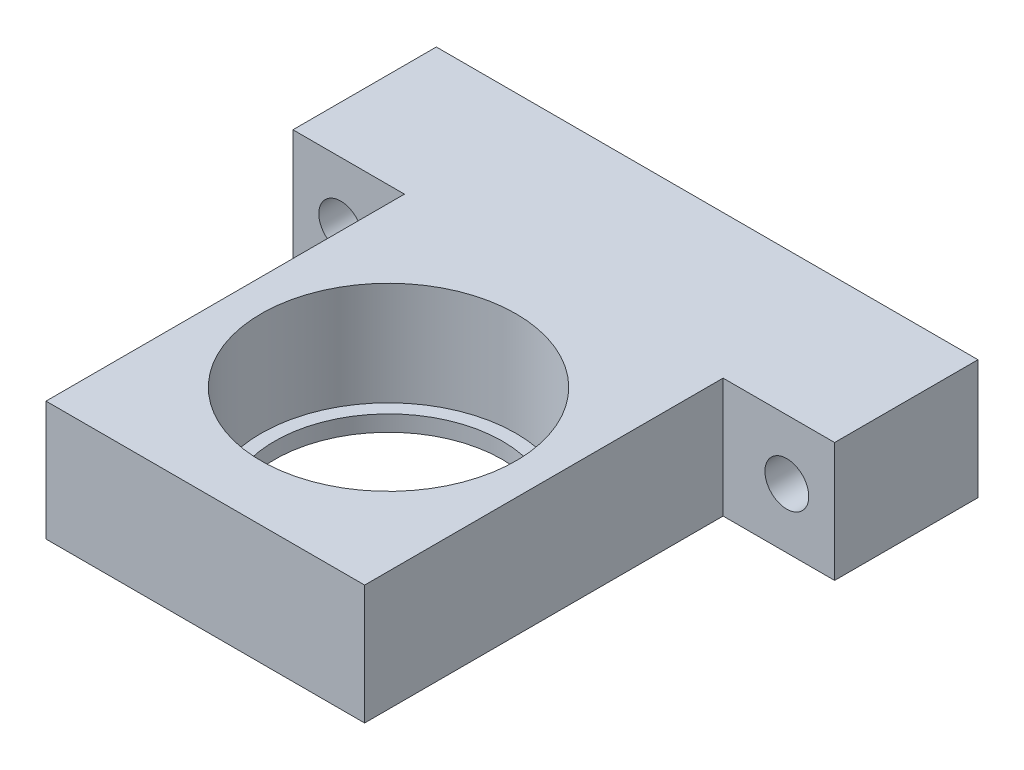
ISO-10303-21;
HEADER;
FILE_DESCRIPTION(('STEP AP214'),'2;1');
FILE_NAME('part.step','',(''),(''),'','','');
FILE_SCHEMA(('AUTOMOTIVE_DESIGN { 1 0 10303 214 1 1 1 1 }'));
ENDSEC;
DATA;
#1=APPLICATION_CONTEXT('core data for automotive mechanical design processes');
#2=APPLICATION_PROTOCOL_DEFINITION('international standard','automotive_design',2000,#1);
#3=PRODUCT_CONTEXT('',#1,'mechanical');
#4=PRODUCT('Part','Part','',(#3));
#5=PRODUCT_RELATED_PRODUCT_CATEGORY('part','',(#4));
#6=PRODUCT_DEFINITION_FORMATION('','',#4);
#7=PRODUCT_DEFINITION_CONTEXT('part definition',#1,'design');
#8=PRODUCT_DEFINITION('design','',#6,#7);
#9=PRODUCT_DEFINITION_SHAPE('','',#8);
#10=(LENGTH_UNIT() NAMED_UNIT(*) SI_UNIT(.MILLI.,.METRE.));
#11=(NAMED_UNIT(*) PLANE_ANGLE_UNIT() SI_UNIT($,.RADIAN.));
#12=(NAMED_UNIT(*) SI_UNIT($,.STERADIAN.) SOLID_ANGLE_UNIT());
#13=UNCERTAINTY_MEASURE_WITH_UNIT(LENGTH_MEASURE(1.E-05),#10,'distance_accuracy_value','');
#14=(GEOMETRIC_REPRESENTATION_CONTEXT(3) GLOBAL_UNCERTAINTY_ASSIGNED_CONTEXT((#13)) GLOBAL_UNIT_ASSIGNED_CONTEXT((#10,
#11,#12)) REPRESENTATION_CONTEXT('',''));
#15=CARTESIAN_POINT('',(0.,0.,0.));
#16=DIRECTION('',(0.,0.,1.));
#17=DIRECTION('',(1.,0.,0.));
#18=AXIS2_PLACEMENT_3D('',#15,#16,#17);
#19=CARTESIAN_POINT('',(0.,35.5,40.));
#20=DIRECTION('',(0.,-1.,0.));
#21=DIRECTION('',(1.,0.,0.));
#22=AXIS2_PLACEMENT_3D('',#19,#20,#21);
#23=CYLINDRICAL_SURFACE('',#22,16.);
#24=CARTESIAN_POINT('',(0.,7.5,40.));
#25=DIRECTION('',(0.,-1.,0.));
#26=DIRECTION('',(0.,0.,-1.));
#27=AXIS2_PLACEMENT_3D('',#24,#25,#26);
#28=CIRCLE('',#27,16.);
#29=CARTESIAN_POINT('',(0.,7.5,24.));
#30=VERTEX_POINT('',#29);
#31=EDGE_CURVE('E202',#30,#30,#28,.T.);
#32=ORIENTED_EDGE('',*,*,#31,.F.);
#33=EDGE_LOOP('',(#32));
#34=FACE_BOUND('',#33,.T.);
#35=CARTESIAN_POINT('',(0.,-5.5,40.));
#36=DIRECTION('',(0.,-1.,0.));
#37=DIRECTION('',(0.,0.,-1.));
#38=AXIS2_PLACEMENT_3D('',#35,#36,#37);
#39=CIRCLE('',#38,16.);
#40=CARTESIAN_POINT('',(0.,-5.5,24.));
#41=VERTEX_POINT('',#40);
#42=EDGE_CURVE('E11',#41,#41,#39,.F.);
#43=ORIENTED_EDGE('',*,*,#42,.F.);
#44=EDGE_LOOP('',(#43));
#45=FACE_BOUND('',#44,.T.);
#46=ADVANCED_FACE('F39',(#34,#45),#23,.F.);
#47=CARTESIAN_POINT('',(0.,0.,18.));
#48=DIRECTION('',(0.,0.,1.));
#49=DIRECTION('',(1.,0.,0.));
#50=AXIS2_PLACEMENT_3D('',#47,#48,#49);
#51=PLANE('',#50);
#52=CARTESIAN_POINT('',(28.,0.,18.));
#53=DIRECTION('',(0.,0.,1.));
#54=DIRECTION('',(1.,0.,0.));
#55=AXIS2_PLACEMENT_3D('',#52,#53,#54);
#56=CIRCLE('',#55,2.75);
#57=CARTESIAN_POINT('',(30.75,0.,18.));
#58=VERTEX_POINT('',#57);
#59=EDGE_CURVE('E182',#58,#58,#56,.T.);
#60=ORIENTED_EDGE('',*,*,#59,.F.);
#61=EDGE_LOOP('',(#60));
#62=FACE_BOUND('',#61,.T.);
#63=DIRECTION('',(0.,1.,0.));
#64=VECTOR('',#63,1.);
#65=CARTESIAN_POINT('',(20.,7.5,18.));
#66=LINE('',#65,#64);
#67=CARTESIAN_POINT('',(20.,-7.5,18.));
#68=VERTEX_POINT('',#67);
#69=CARTESIAN_POINT('',(20.,7.5,18.));
#70=VERTEX_POINT('',#69);
#71=EDGE_CURVE('E57',#68,#70,#66,.T.);
#72=ORIENTED_EDGE('',*,*,#71,.F.);
#73=DIRECTION('',(1.,0.,0.));
#74=VECTOR('',#73,1.);
#75=CARTESIAN_POINT('',(-34.,-7.5,18.));
#76=LINE('',#75,#74);
#77=CARTESIAN_POINT('',(34.,-7.5,18.));
#78=VERTEX_POINT('',#77);
#79=EDGE_CURVE('E154',#68,#78,#76,.T.);
#80=ORIENTED_EDGE('',*,*,#79,.T.);
#81=DIRECTION('',(0.,1.,0.));
#82=VECTOR('',#81,1.);
#83=CARTESIAN_POINT('',(34.,7.5,18.));
#84=LINE('',#83,#82);
#85=CARTESIAN_POINT('',(34.,7.5,18.));
#86=VERTEX_POINT('',#85);
#87=EDGE_CURVE('E142',#78,#86,#84,.T.);
#88=ORIENTED_EDGE('',*,*,#87,.T.);
#89=DIRECTION('',(-1.,0.,0.));
#90=VECTOR('',#89,1.);
#91=CARTESIAN_POINT('',(-34.,7.5,18.));
#92=LINE('',#91,#90);
#93=EDGE_CURVE('E148',#86,#70,#92,.T.);
#94=ORIENTED_EDGE('',*,*,#93,.T.);
#95=EDGE_LOOP('',(#72,#80,#88,#94));
#96=FACE_BOUND('',#95,.T.);
#97=ADVANCED_FACE('F239',(#62,#96),#51,.T.);
#98=CARTESIAN_POINT('',(34.,7.5,18.));
#99=DIRECTION('',(-1.,0.,0.));
#100=DIRECTION('',(0.,0.,1.));
#101=AXIS2_PLACEMENT_3D('',#98,#99,#100);
#102=PLANE('',#101);
#103=DIRECTION('',(0.,1.,0.));
#104=VECTOR('',#103,1.);
#105=CARTESIAN_POINT('',(34.,7.5,0.));
#106=LINE('',#105,#104);
#107=CARTESIAN_POINT('',(34.,-7.5,0.));
#108=VERTEX_POINT('',#107);
#109=CARTESIAN_POINT('',(34.,7.5,0.));
#110=VERTEX_POINT('',#109);
#111=EDGE_CURVE('E131',#108,#110,#106,.T.);
#112=ORIENTED_EDGE('',*,*,#111,.T.);
#113=DIRECTION('',(0.,0.,-1.));
#114=VECTOR('',#113,1.);
#115=CARTESIAN_POINT('',(34.,7.5,18.));
#116=LINE('',#115,#114);
#117=EDGE_CURVE('E49',#86,#110,#116,.T.);
#118=ORIENTED_EDGE('',*,*,#117,.F.);
#119=ORIENTED_EDGE('',*,*,#87,.F.);
#120=DIRECTION('',(0.,0.,-1.));
#121=VECTOR('',#120,1.);
#122=CARTESIAN_POINT('',(34.,-7.5,18.));
#123=LINE('',#122,#121);
#124=EDGE_CURVE('E157',#78,#108,#123,.T.);
#125=ORIENTED_EDGE('',*,*,#124,.T.);
#126=EDGE_LOOP('',(#112,#118,#119,#125));
#127=FACE_BOUND('',#126,.T.);
#128=ADVANCED_FACE('F41',(#127),#102,.F.);
#129=CARTESIAN_POINT('',(-34.,7.5,18.));
#130=DIRECTION('',(0.,-1.,0.));
#131=DIRECTION('',(0.,0.,-1.));
#132=AXIS2_PLACEMENT_3D('',#129,#130,#131);
#133=PLANE('',#132);
#134=ORIENTED_EDGE('',*,*,#31,.T.);
#135=EDGE_LOOP('',(#134));
#136=FACE_BOUND('',#135,.T.);
#137=DIRECTION('',(-1.,0.,0.));
#138=VECTOR('',#137,1.);
#139=CARTESIAN_POINT('',(-34.,7.5,0.));
#140=LINE('',#139,#138);
#141=CARTESIAN_POINT('',(-34.,7.5,0.));
#142=VERTEX_POINT('',#141);
#143=EDGE_CURVE('E136',#110,#142,#140,.T.);
#144=ORIENTED_EDGE('',*,*,#143,.T.);
#145=DIRECTION('',(0.,0.,-1.));
#146=VECTOR('',#145,1.);
#147=CARTESIAN_POINT('',(-34.,7.5,18.));
#148=LINE('',#147,#146);
#149=CARTESIAN_POINT('',(-34.,7.5,18.));
#150=VERTEX_POINT('',#149);
#151=EDGE_CURVE('E173',#150,#142,#148,.T.);
#152=ORIENTED_EDGE('',*,*,#151,.F.);
#153=CARTESIAN_POINT('',(-20.,7.5,18.));
#154=VERTEX_POINT('',#153);
#155=EDGE_CURVE('E146',#154,#150,#92,.T.);
#156=ORIENTED_EDGE('',*,*,#155,.F.);
#157=DIRECTION('',(0.,0.,-1.));
#158=VECTOR('',#157,1.);
#159=CARTESIAN_POINT('',(-20.,7.5,63.));
#160=LINE('',#159,#158);
#161=CARTESIAN_POINT('',(-20.,7.5,63.));
#162=VERTEX_POINT('',#161);
#163=EDGE_CURVE('E113',#162,#154,#160,.T.);
#164=ORIENTED_EDGE('',*,*,#163,.F.);
#165=DIRECTION('',(-1.,0.,0.));
#166=VECTOR('',#165,1.);
#167=CARTESIAN_POINT('',(-20.,7.5,63.));
#168=LINE('',#167,#166);
#169=CARTESIAN_POINT('',(20.,7.5,63.));
#170=VERTEX_POINT('',#169);
#171=EDGE_CURVE('E107',#170,#162,#168,.T.);
#172=ORIENTED_EDGE('',*,*,#171,.F.);
#173=DIRECTION('',(0.,0.,-1.));
#174=VECTOR('',#173,1.);
#175=CARTESIAN_POINT('',(20.,7.5,63.));
#176=LINE('',#175,#174);
#177=EDGE_CURVE('E111',#170,#70,#176,.T.);
#178=ORIENTED_EDGE('',*,*,#177,.T.);
#179=ORIENTED_EDGE('',*,*,#93,.F.);
#180=ORIENTED_EDGE('',*,*,#117,.T.);
#181=EDGE_LOOP('',(#144,#152,#156,#164,#172,#178,#179,#180));
#182=FACE_BOUND('',#181,.T.);
#183=ADVANCED_FACE('F109',(#136,#182),#133,.F.);
#184=CARTESIAN_POINT('',(-34.,7.5,18.));
#185=DIRECTION('',(1.,0.,0.));
#186=DIRECTION('',(0.,0.,-1.));
#187=AXIS2_PLACEMENT_3D('',#184,#185,#186);
#188=PLANE('',#187);
#189=DIRECTION('',(0.,-1.,0.));
#190=VECTOR('',#189,1.);
#191=CARTESIAN_POINT('',(-34.,7.5,0.));
#192=LINE('',#191,#190);
#193=CARTESIAN_POINT('',(-34.,-7.5,0.));
#194=VERTEX_POINT('',#193);
#195=EDGE_CURVE('E161',#142,#194,#192,.T.);
#196=ORIENTED_EDGE('',*,*,#195,.T.);
#197=DIRECTION('',(0.,0.,-1.));
#198=VECTOR('',#197,1.);
#199=CARTESIAN_POINT('',(-34.,-7.5,18.));
#200=LINE('',#199,#198);
#201=CARTESIAN_POINT('',(-34.,-7.5,18.));
#202=VERTEX_POINT('',#201);
#203=EDGE_CURVE('E169',#202,#194,#200,.T.);
#204=ORIENTED_EDGE('',*,*,#203,.F.);
#205=DIRECTION('',(0.,-1.,0.));
#206=VECTOR('',#205,1.);
#207=CARTESIAN_POINT('',(-34.,7.5,18.));
#208=LINE('',#207,#206);
#209=EDGE_CURVE('E151',#150,#202,#208,.T.);
#210=ORIENTED_EDGE('',*,*,#209,.F.);
#211=ORIENTED_EDGE('',*,*,#151,.T.);
#212=EDGE_LOOP('',(#196,#204,#210,#211));
#213=FACE_BOUND('',#212,.T.);
#214=ADVANCED_FACE('F282',(#213),#188,.F.);
#215=CARTESIAN_POINT('',(-34.,-7.5,18.));
#216=DIRECTION('',(0.,1.,0.));
#217=DIRECTION('',(0.,0.,1.));
#218=AXIS2_PLACEMENT_3D('',#215,#216,#217);
#219=PLANE('',#218);
#220=DIRECTION('',(1.,0.,0.));
#221=VECTOR('',#220,1.);
#222=CARTESIAN_POINT('',(-34.,-7.5,0.));
#223=LINE('',#222,#221);
#224=EDGE_CURVE('E147',#194,#108,#223,.T.);
#225=ORIENTED_EDGE('',*,*,#224,.T.);
#226=ORIENTED_EDGE('',*,*,#124,.F.);
#227=ORIENTED_EDGE('',*,*,#79,.F.);
#228=DIRECTION('',(0.,0.,-1.));
#229=VECTOR('',#228,1.);
#230=CARTESIAN_POINT('',(20.,-7.5,63.));
#231=LINE('',#230,#229);
#232=CARTESIAN_POINT('',(20.,-7.5,63.));
#233=VERTEX_POINT('',#232);
#234=EDGE_CURVE('E213',#233,#68,#231,.T.);
#235=ORIENTED_EDGE('',*,*,#234,.F.);
#236=DIRECTION('',(1.,0.,0.));
#237=VECTOR('',#236,1.);
#238=CARTESIAN_POINT('',(-20.,-7.5,63.));
#239=LINE('',#238,#237);
#240=CARTESIAN_POINT('',(-20.,-7.5,63.));
#241=VERTEX_POINT('',#240);
#242=EDGE_CURVE('E123',#241,#233,#239,.T.);
#243=ORIENTED_EDGE('',*,*,#242,.F.);
#244=DIRECTION('',(0.,0.,-1.));
#245=VECTOR('',#244,1.);
#246=CARTESIAN_POINT('',(-20.,-7.5,63.));
#247=LINE('',#246,#245);
#248=CARTESIAN_POINT('',(-20.,-7.5,18.));
#249=VERTEX_POINT('',#248);
#250=EDGE_CURVE('E138',#241,#249,#247,.T.);
#251=ORIENTED_EDGE('',*,*,#250,.T.);
#252=EDGE_CURVE('E155',#202,#249,#76,.T.);
#253=ORIENTED_EDGE('',*,*,#252,.F.);
#254=ORIENTED_EDGE('',*,*,#203,.T.);
#255=EDGE_LOOP('',(#225,#226,#227,#235,#243,#251,#253,#254));
#256=FACE_BOUND('',#255,.T.);
#257=CARTESIAN_POINT('',(0.,-7.5,40.));
#258=DIRECTION('',(0.,-1.,0.));
#259=DIRECTION('',(0.,0.,-1.));
#260=AXIS2_PLACEMENT_3D('',#257,#258,#259);
#261=CIRCLE('',#260,14.3);
#262=CARTESIAN_POINT('',(0.,-7.5,25.7));
#263=VERTEX_POINT('',#262);
#264=EDGE_CURVE('E188',#263,#263,#261,.T.);
#265=ORIENTED_EDGE('',*,*,#264,.F.);
#266=EDGE_LOOP('',(#265));
#267=FACE_BOUND('',#266,.T.);
#268=ADVANCED_FACE('F224',(#256,#267),#219,.F.);
#269=CARTESIAN_POINT('',(-28.,0.,18.));
#270=DIRECTION('',(0.,0.,1.));
#271=DIRECTION('',(1.,0.,0.));
#272=AXIS2_PLACEMENT_3D('',#269,#270,#271);
#273=CIRCLE('',#272,2.75);
#274=CARTESIAN_POINT('',(-25.25,0.,18.));
#275=VERTEX_POINT('',#274);
#276=EDGE_CURVE('E190',#275,#275,#273,.T.);
#277=ORIENTED_EDGE('',*,*,#276,.F.);
#278=EDGE_LOOP('',(#277));
#279=FACE_BOUND('',#278,.T.);
#280=DIRECTION('',(0.,-1.,0.));
#281=VECTOR('',#280,1.);
#282=CARTESIAN_POINT('',(-20.,7.5,18.));
#283=LINE('',#282,#281);
#284=EDGE_CURVE('E65',#154,#249,#283,.T.);
#285=ORIENTED_EDGE('',*,*,#284,.F.);
#286=ORIENTED_EDGE('',*,*,#155,.T.);
#287=ORIENTED_EDGE('',*,*,#209,.T.);
#288=ORIENTED_EDGE('',*,*,#252,.T.);
#289=EDGE_LOOP('',(#285,#286,#287,#288));
#290=FACE_BOUND('',#289,.T.);
#291=ADVANCED_FACE('F247',(#279,#290),#51,.T.);
#292=CARTESIAN_POINT('',(0.,0.,0.));
#293=DIRECTION('',(0.,0.,1.));
#294=DIRECTION('',(1.,0.,0.));
#295=AXIS2_PLACEMENT_3D('',#292,#293,#294);
#296=PLANE('',#295);
#297=CARTESIAN_POINT('',(28.,0.,0.));
#298=DIRECTION('',(0.,0.,1.));
#299=DIRECTION('',(1.,0.,0.));
#300=AXIS2_PLACEMENT_3D('',#297,#298,#299);
#301=CIRCLE('',#300,2.75);
#302=CARTESIAN_POINT('',(30.75,0.,0.));
#303=VERTEX_POINT('',#302);
#304=EDGE_CURVE('E43',#303,#303,#301,.T.);
#305=ORIENTED_EDGE('',*,*,#304,.T.);
#306=EDGE_LOOP('',(#305));
#307=FACE_BOUND('',#306,.T.);
#308=CARTESIAN_POINT('',(-28.,0.,0.));
#309=DIRECTION('',(0.,0.,1.));
#310=DIRECTION('',(1.,0.,0.));
#311=AXIS2_PLACEMENT_3D('',#308,#309,#310);
#312=CIRCLE('',#311,2.75);
#313=CARTESIAN_POINT('',(-25.25,0.,0.));
#314=VERTEX_POINT('',#313);
#315=EDGE_CURVE('E179',#314,#314,#312,.T.);
#316=ORIENTED_EDGE('',*,*,#315,.T.);
#317=EDGE_LOOP('',(#316));
#318=FACE_BOUND('',#317,.T.);
#319=ORIENTED_EDGE('',*,*,#111,.F.);
#320=ORIENTED_EDGE('',*,*,#224,.F.);
#321=ORIENTED_EDGE('',*,*,#195,.F.);
#322=ORIENTED_EDGE('',*,*,#143,.F.);
#323=EDGE_LOOP('',(#319,#320,#321,#322));
#324=FACE_BOUND('',#323,.T.);
#325=ADVANCED_FACE('F236',(#307,#318,#324),#296,.F.);
#326=CARTESIAN_POINT('',(20.,7.5,63.));
#327=DIRECTION('',(-1.,0.,0.));
#328=DIRECTION('',(0.,0.,1.));
#329=AXIS2_PLACEMENT_3D('',#326,#327,#328);
#330=PLANE('',#329);
#331=ORIENTED_EDGE('',*,*,#71,.T.);
#332=ORIENTED_EDGE('',*,*,#177,.F.);
#333=DIRECTION('',(0.,1.,0.));
#334=VECTOR('',#333,1.);
#335=CARTESIAN_POINT('',(20.,7.5,63.));
#336=LINE('',#335,#334);
#337=EDGE_CURVE('E118',#233,#170,#336,.T.);
#338=ORIENTED_EDGE('',*,*,#337,.F.);
#339=ORIENTED_EDGE('',*,*,#234,.T.);
#340=EDGE_LOOP('',(#331,#332,#338,#339));
#341=FACE_BOUND('',#340,.T.);
#342=ADVANCED_FACE('F129',(#341),#330,.F.);
#343=CARTESIAN_POINT('',(-20.,7.5,63.));
#344=DIRECTION('',(1.,0.,0.));
#345=DIRECTION('',(0.,0.,-1.));
#346=AXIS2_PLACEMENT_3D('',#343,#344,#345);
#347=PLANE('',#346);
#348=ORIENTED_EDGE('',*,*,#284,.T.);
#349=ORIENTED_EDGE('',*,*,#250,.F.);
#350=DIRECTION('',(0.,-1.,0.));
#351=VECTOR('',#350,1.);
#352=CARTESIAN_POINT('',(-20.,7.5,63.));
#353=LINE('',#352,#351);
#354=EDGE_CURVE('E117',#162,#241,#353,.T.);
#355=ORIENTED_EDGE('',*,*,#354,.F.);
#356=ORIENTED_EDGE('',*,*,#163,.T.);
#357=EDGE_LOOP('',(#348,#349,#355,#356));
#358=FACE_BOUND('',#357,.T.);
#359=ADVANCED_FACE('F227',(#358),#347,.F.);
#360=CARTESIAN_POINT('',(0.,0.,63.));
#361=DIRECTION('',(0.,0.,1.));
#362=DIRECTION('',(1.,0.,0.));
#363=AXIS2_PLACEMENT_3D('',#360,#361,#362);
#364=PLANE('',#363);
#365=ORIENTED_EDGE('',*,*,#337,.T.);
#366=ORIENTED_EDGE('',*,*,#171,.T.);
#367=ORIENTED_EDGE('',*,*,#354,.T.);
#368=ORIENTED_EDGE('',*,*,#242,.T.);
#369=EDGE_LOOP('',(#365,#366,#367,#368));
#370=FACE_BOUND('',#369,.T.);
#371=ADVANCED_FACE('F121',(#370),#364,.T.);
#372=CARTESIAN_POINT('',(0.,-5.5,40.));
#373=DIRECTION('',(0.,-1.,0.));
#374=DIRECTION('',(0.,0.,-1.));
#375=AXIS2_PLACEMENT_3D('',#372,#373,#374);
#376=PLANE('',#375);
#377=CARTESIAN_POINT('',(0.,-5.5,40.));
#378=DIRECTION('',(0.,-1.,0.));
#379=DIRECTION('',(0.,0.,-1.));
#380=AXIS2_PLACEMENT_3D('',#377,#378,#379);
#381=CIRCLE('',#380,14.3);
#382=CARTESIAN_POINT('',(0.,-5.5,25.7));
#383=VERTEX_POINT('',#382);
#384=EDGE_CURVE('E198',#383,#383,#381,.T.);
#385=ORIENTED_EDGE('',*,*,#384,.T.);
#386=EDGE_LOOP('',(#385));
#387=FACE_BOUND('',#386,.T.);
#388=ORIENTED_EDGE('',*,*,#42,.T.);
#389=EDGE_LOOP('',(#388));
#390=FACE_BOUND('',#389,.T.);
#391=ADVANCED_FACE('F234',(#387,#390),#376,.F.);
#392=CARTESIAN_POINT('',(0.,-5.5,40.));
#393=DIRECTION('',(0.,-1.,0.));
#394=DIRECTION('',(0.,0.,-1.));
#395=AXIS2_PLACEMENT_3D('',#392,#393,#394);
#396=CYLINDRICAL_SURFACE('',#395,14.3);
#397=ORIENTED_EDGE('',*,*,#384,.F.);
#398=EDGE_LOOP('',(#397));
#399=FACE_BOUND('',#398,.T.);
#400=ORIENTED_EDGE('',*,*,#264,.T.);
#401=EDGE_LOOP('',(#400));
#402=FACE_BOUND('',#401,.T.);
#403=ADVANCED_FACE('F253',(#399,#402),#396,.F.);
#404=CARTESIAN_POINT('',(-28.,0.,-3.));
#405=DIRECTION('',(0.,0.,1.));
#406=DIRECTION('',(1.,0.,0.));
#407=AXIS2_PLACEMENT_3D('',#404,#405,#406);
#408=CYLINDRICAL_SURFACE('',#407,2.75);
#409=CARTESIAN_POINT('',(-25.25,0.,18.));
#410=CARTESIAN_POINT('',(-25.25,0.,17.8125));
#411=CARTESIAN_POINT('',(-25.25,0.,17.625));
#412=CARTESIAN_POINT('',(-25.25,0.,17.25));
#413=CARTESIAN_POINT('',(-25.25,0.,17.0625));
#414=CARTESIAN_POINT('',(-25.25,0.,16.6875));
#415=CARTESIAN_POINT('',(-25.25,0.,16.5));
#416=CARTESIAN_POINT('',(-25.25,0.,16.125));
#417=CARTESIAN_POINT('',(-25.25,0.,15.9375));
#418=CARTESIAN_POINT('',(-25.25,0.,15.5625));
#419=CARTESIAN_POINT('',(-25.25,0.,15.375));
#420=CARTESIAN_POINT('',(-25.25,0.,15.));
#421=CARTESIAN_POINT('',(-25.25,0.,14.8125));
#422=CARTESIAN_POINT('',(-25.25,0.,14.4375));
#423=CARTESIAN_POINT('',(-25.25,0.,14.25));
#424=CARTESIAN_POINT('',(-25.25,0.,13.875));
#425=CARTESIAN_POINT('',(-25.25,0.,13.6875));
#426=CARTESIAN_POINT('',(-25.25,0.,13.3125));
#427=CARTESIAN_POINT('',(-25.25,0.,13.125));
#428=CARTESIAN_POINT('',(-25.25,0.,12.75));
#429=CARTESIAN_POINT('',(-25.25,0.,12.5625));
#430=CARTESIAN_POINT('',(-25.25,0.,12.1875));
#431=CARTESIAN_POINT('',(-25.25,0.,12.));
#432=CARTESIAN_POINT('',(-25.25,0.,11.625));
#433=CARTESIAN_POINT('',(-25.25,0.,11.4375));
#434=CARTESIAN_POINT('',(-25.25,0.,11.0625));
#435=CARTESIAN_POINT('',(-25.25,0.,10.875));
#436=CARTESIAN_POINT('',(-25.25,0.,10.5));
#437=CARTESIAN_POINT('',(-25.25,0.,10.3125));
#438=CARTESIAN_POINT('',(-25.25,0.,9.9375));
#439=CARTESIAN_POINT('',(-25.25,0.,9.75));
#440=CARTESIAN_POINT('',(-25.25,0.,9.375));
#441=CARTESIAN_POINT('',(-25.25,0.,9.1875));
#442=CARTESIAN_POINT('',(-25.25,0.,8.8125));
#443=CARTESIAN_POINT('',(-25.25,0.,8.625));
#444=CARTESIAN_POINT('',(-25.25,0.,8.25));
#445=CARTESIAN_POINT('',(-25.25,0.,8.0625));
#446=CARTESIAN_POINT('',(-25.25,0.,7.6875));
#447=CARTESIAN_POINT('',(-25.25,0.,7.5));
#448=CARTESIAN_POINT('',(-25.25,0.,7.125));
#449=CARTESIAN_POINT('',(-25.25,0.,6.9375));
#450=CARTESIAN_POINT('',(-25.25,0.,6.5625));
#451=CARTESIAN_POINT('',(-25.25,0.,6.375));
#452=CARTESIAN_POINT('',(-25.25,0.,6.));
#453=CARTESIAN_POINT('',(-25.25,0.,5.8125));
#454=CARTESIAN_POINT('',(-25.25,0.,5.4375));
#455=CARTESIAN_POINT('',(-25.25,0.,5.25));
#456=CARTESIAN_POINT('',(-25.25,0.,4.875));
#457=CARTESIAN_POINT('',(-25.25,0.,4.6875));
#458=CARTESIAN_POINT('',(-25.25,0.,4.3125));
#459=CARTESIAN_POINT('',(-25.25,0.,4.125));
#460=CARTESIAN_POINT('',(-25.25,0.,3.75));
#461=CARTESIAN_POINT('',(-25.25,0.,3.5625));
#462=CARTESIAN_POINT('',(-25.25,0.,3.1875));
#463=CARTESIAN_POINT('',(-25.25,0.,3.));
#464=CARTESIAN_POINT('',(-25.25,0.,2.625));
#465=CARTESIAN_POINT('',(-25.25,0.,2.4375));
#466=CARTESIAN_POINT('',(-25.25,0.,2.0625));
#467=CARTESIAN_POINT('',(-25.25,0.,1.875));
#468=CARTESIAN_POINT('',(-25.25,0.,1.5));
#469=CARTESIAN_POINT('',(-25.25,0.,1.3125));
#470=CARTESIAN_POINT('',(-25.25,0.,0.9375));
#471=CARTESIAN_POINT('',(-25.25,0.,0.75));
#472=CARTESIAN_POINT('',(-25.25,0.,0.375));
#473=CARTESIAN_POINT('',(-25.25,0.,0.1875));
#474=CARTESIAN_POINT('',(-25.25,0.,0.));
#475=B_SPLINE_CURVE_WITH_KNOTS('',3,(#409,#410,#411,#412,#413,#414,#415,#416,#417,#418,#419,
#420,#421,#422,#423,#424,#425,#426,#427,#428,#429,#430,#431,#432,#433,#434,#435,#436,#437,#438,
#439,#440,#441,#442,#443,#444,#445,#446,#447,#448,#449,#450,#451,#452,#453,#454,#455,#456,#457,
#458,#459,#460,#461,#462,#463,#464,#465,#466,#467,#468,#469,#470,#471,#472,#473,#474),
.UNSPECIFIED.,.F.,.F.,(4,2,2,2,2,2,2,2,2,2,2,2,2,2,2,2,2,2,2,2,2,2,2,2,2,2,2,2,2,2,2,2,4),(0.,
0.5625,1.125,1.6875,2.25,2.8125,3.375,3.9375,4.5,5.0625,5.625,6.1875,6.75,7.3125,7.875,8.4375,
9.,9.5625,10.125,10.6875,11.25,11.8125,12.375,12.9375,13.5,14.0625,14.625,15.1875,15.75,16.3125,
16.875,17.4375,18.),.UNSPECIFIED.);
#476=EDGE_CURVE('BSEAM257',#275,#314,#475,.T.);
#477=ORIENTED_EDGE('',*,*,#276,.T.);
#478=ORIENTED_EDGE('',*,*,#315,.F.);
#479=ORIENTED_EDGE('',*,*,#476,.T.);
#480=ORIENTED_EDGE('',*,*,#476,.F.);
#481=EDGE_LOOP('',(#477,#479,#478,#480));
#482=FACE_BOUND('',#481,.T.);
#483=ADVANCED_FACE('F257',(#482),#408,.F.);
#484=CARTESIAN_POINT('',(28.,0.,-3.));
#485=DIRECTION('',(0.,0.,1.));
#486=DIRECTION('',(1.,0.,0.));
#487=AXIS2_PLACEMENT_3D('',#484,#485,#486);
#488=CYLINDRICAL_SURFACE('',#487,2.75);
#489=CARTESIAN_POINT('',(30.75,0.,18.));
#490=CARTESIAN_POINT('',(30.75,0.,17.8125));
#491=CARTESIAN_POINT('',(30.75,0.,17.625));
#492=CARTESIAN_POINT('',(30.75,0.,17.25));
#493=CARTESIAN_POINT('',(30.75,0.,17.0625));
#494=CARTESIAN_POINT('',(30.75,0.,16.6875));
#495=CARTESIAN_POINT('',(30.75,0.,16.5));
#496=CARTESIAN_POINT('',(30.75,0.,16.125));
#497=CARTESIAN_POINT('',(30.75,0.,15.9375));
#498=CARTESIAN_POINT('',(30.75,0.,15.5625));
#499=CARTESIAN_POINT('',(30.75,0.,15.375));
#500=CARTESIAN_POINT('',(30.75,0.,15.));
#501=CARTESIAN_POINT('',(30.75,0.,14.8125));
#502=CARTESIAN_POINT('',(30.75,0.,14.4375));
#503=CARTESIAN_POINT('',(30.75,0.,14.25));
#504=CARTESIAN_POINT('',(30.75,0.,13.875));
#505=CARTESIAN_POINT('',(30.75,0.,13.6875));
#506=CARTESIAN_POINT('',(30.75,0.,13.3125));
#507=CARTESIAN_POINT('',(30.75,0.,13.125));
#508=CARTESIAN_POINT('',(30.75,0.,12.75));
#509=CARTESIAN_POINT('',(30.75,0.,12.5625));
#510=CARTESIAN_POINT('',(30.75,0.,12.1875));
#511=CARTESIAN_POINT('',(30.75,0.,12.));
#512=CARTESIAN_POINT('',(30.75,0.,11.625));
#513=CARTESIAN_POINT('',(30.75,0.,11.4375));
#514=CARTESIAN_POINT('',(30.75,0.,11.0625));
#515=CARTESIAN_POINT('',(30.75,0.,10.875));
#516=CARTESIAN_POINT('',(30.75,0.,10.5));
#517=CARTESIAN_POINT('',(30.75,0.,10.3125));
#518=CARTESIAN_POINT('',(30.75,0.,9.9375));
#519=CARTESIAN_POINT('',(30.75,0.,9.75));
#520=CARTESIAN_POINT('',(30.75,0.,9.375));
#521=CARTESIAN_POINT('',(30.75,0.,9.1875));
#522=CARTESIAN_POINT('',(30.75,0.,8.8125));
#523=CARTESIAN_POINT('',(30.75,0.,8.625));
#524=CARTESIAN_POINT('',(30.75,0.,8.25));
#525=CARTESIAN_POINT('',(30.75,0.,8.0625));
#526=CARTESIAN_POINT('',(30.75,0.,7.6875));
#527=CARTESIAN_POINT('',(30.75,0.,7.5));
#528=CARTESIAN_POINT('',(30.75,0.,7.125));
#529=CARTESIAN_POINT('',(30.75,0.,6.9375));
#530=CARTESIAN_POINT('',(30.75,0.,6.5625));
#531=CARTESIAN_POINT('',(30.75,0.,6.375));
#532=CARTESIAN_POINT('',(30.75,0.,6.));
#533=CARTESIAN_POINT('',(30.75,0.,5.8125));
#534=CARTESIAN_POINT('',(30.75,0.,5.4375));
#535=CARTESIAN_POINT('',(30.75,0.,5.25));
#536=CARTESIAN_POINT('',(30.75,0.,4.875));
#537=CARTESIAN_POINT('',(30.75,0.,4.6875));
#538=CARTESIAN_POINT('',(30.75,0.,4.3125));
#539=CARTESIAN_POINT('',(30.75,0.,4.125));
#540=CARTESIAN_POINT('',(30.75,0.,3.75));
#541=CARTESIAN_POINT('',(30.75,0.,3.5625));
#542=CARTESIAN_POINT('',(30.75,0.,3.1875));
#543=CARTESIAN_POINT('',(30.75,0.,3.));
#544=CARTESIAN_POINT('',(30.75,0.,2.625));
#545=CARTESIAN_POINT('',(30.75,0.,2.4375));
#546=CARTESIAN_POINT('',(30.75,0.,2.0625));
#547=CARTESIAN_POINT('',(30.75,0.,1.875));
#548=CARTESIAN_POINT('',(30.75,0.,1.5));
#549=CARTESIAN_POINT('',(30.75,0.,1.3125));
#550=CARTESIAN_POINT('',(30.75,0.,0.9375));
#551=CARTESIAN_POINT('',(30.75,0.,0.75));
#552=CARTESIAN_POINT('',(30.75,0.,0.375));
#553=CARTESIAN_POINT('',(30.75,0.,0.1875));
#554=CARTESIAN_POINT('',(30.75,0.,0.));
#555=B_SPLINE_CURVE_WITH_KNOTS('',3,(#489,#490,#491,#492,#493,#494,#495,#496,#497,#498,#499,
#500,#501,#502,#503,#504,#505,#506,#507,#508,#509,#510,#511,#512,#513,#514,#515,#516,#517,#518,
#519,#520,#521,#522,#523,#524,#525,#526,#527,#528,#529,#530,#531,#532,#533,#534,#535,#536,#537,
#538,#539,#540,#541,#542,#543,#544,#545,#546,#547,#548,#549,#550,#551,#552,#553,#554),
.UNSPECIFIED.,.F.,.F.,(4,2,2,2,2,2,2,2,2,2,2,2,2,2,2,2,2,2,2,2,2,2,2,2,2,2,2,2,2,2,2,2,4),(0.,
0.5625,1.125,1.6875,2.25,2.8125,3.375,3.9375,4.5,5.0625,5.625,6.1875,6.75,7.3125,7.875,8.4375,
9.,9.5625,10.125,10.6875,11.25,11.8125,12.375,12.9375,13.5,14.0625,14.625,15.1875,15.75,16.3125,
16.875,17.4375,18.),.UNSPECIFIED.);
#556=EDGE_CURVE('BSEAM261',#58,#303,#555,.T.);
#557=ORIENTED_EDGE('',*,*,#59,.T.);
#558=ORIENTED_EDGE('',*,*,#304,.F.);
#559=ORIENTED_EDGE('',*,*,#556,.T.);
#560=ORIENTED_EDGE('',*,*,#556,.F.);
#561=EDGE_LOOP('',(#557,#559,#558,#560));
#562=FACE_BOUND('',#561,.T.);
#563=ADVANCED_FACE('F261',(#562),#488,.F.);
#564=CLOSED_SHELL('',(#46,#97,#128,#183,#214,#268,#291,#325,#342,#359,#371,#391,#403,#483,#563));
#565=MANIFOLD_SOLID_BREP('B2',#564);
#566=ADVANCED_BREP_SHAPE_REPRESENTATION('',(#18,#565),#14);
#567=SHAPE_DEFINITION_REPRESENTATION(#9,#566);
ENDSEC;
END-ISO-10303-21;
